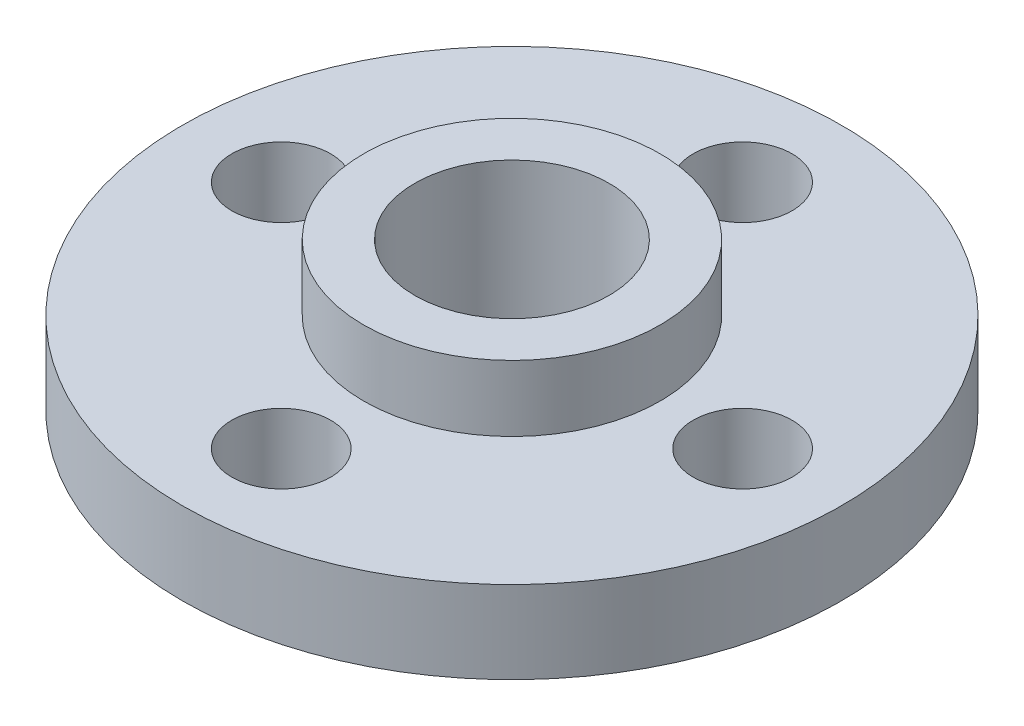
ISO-10303-21;
HEADER;
FILE_DESCRIPTION(('STEP AP214'),'2;1');
FILE_NAME('part.step','',(''),(''),'','','');
FILE_SCHEMA(('AUTOMOTIVE_DESIGN { 1 0 10303 214 1 1 1 1 }'));
ENDSEC;
DATA;
#1=APPLICATION_CONTEXT('core data for automotive mechanical design processes');
#2=APPLICATION_PROTOCOL_DEFINITION('international standard','automotive_design',2000,#1);
#3=PRODUCT_CONTEXT('',#1,'mechanical');
#4=PRODUCT('Part','Part','',(#3));
#5=PRODUCT_RELATED_PRODUCT_CATEGORY('part','',(#4));
#6=PRODUCT_DEFINITION_FORMATION('','',#4);
#7=PRODUCT_DEFINITION_CONTEXT('part definition',#1,'design');
#8=PRODUCT_DEFINITION('design','',#6,#7);
#9=PRODUCT_DEFINITION_SHAPE('','',#8);
#10=(LENGTH_UNIT() NAMED_UNIT(*) SI_UNIT(.MILLI.,.METRE.));
#11=(NAMED_UNIT(*) PLANE_ANGLE_UNIT() SI_UNIT($,.RADIAN.));
#12=(NAMED_UNIT(*) SI_UNIT($,.STERADIAN.) SOLID_ANGLE_UNIT());
#13=UNCERTAINTY_MEASURE_WITH_UNIT(LENGTH_MEASURE(1.E-05),#10,'distance_accuracy_value','');
#14=(GEOMETRIC_REPRESENTATION_CONTEXT(3) GLOBAL_UNCERTAINTY_ASSIGNED_CONTEXT((#13)) GLOBAL_UNIT_ASSIGNED_CONTEXT((#10,
#11,#12)) REPRESENTATION_CONTEXT('',''));
#15=CARTESIAN_POINT('',(0.,0.,0.));
#16=DIRECTION('',(0.,0.,1.));
#17=DIRECTION('',(1.,0.,0.));
#18=AXIS2_PLACEMENT_3D('',#15,#16,#17);
#19=CARTESIAN_POINT('',(0.,2.5,0.));
#20=DIRECTION('',(0.,1.,0.));
#21=DIRECTION('',(0.,0.,1.));
#22=AXIS2_PLACEMENT_3D('',#19,#20,#21);
#23=PLANE('',#22);
#24=CARTESIAN_POINT('',(0.,2.5,7.));
#25=DIRECTION('',(0.,1.,0.));
#26=DIRECTION('',(0.,0.,1.));
#27=AXIS2_PLACEMENT_3D('',#24,#25,#26);
#28=CIRCLE('',#27,1.5);
#29=CARTESIAN_POINT('',(0.,2.5,8.5));
#30=VERTEX_POINT('',#29);
#31=EDGE_CURVE('E55',#30,#30,#28,.T.);
#32=ORIENTED_EDGE('',*,*,#31,.F.);
#33=EDGE_LOOP('',(#32));
#34=FACE_BOUND('',#33,.T.);
#35=CARTESIAN_POINT('',(-7.,2.5,0.));
#36=DIRECTION('',(0.,1.,0.));
#37=DIRECTION('',(0.,0.,1.));
#38=AXIS2_PLACEMENT_3D('',#35,#36,#37);
#39=CIRCLE('',#38,1.5);
#40=CARTESIAN_POINT('',(-7.,2.5,1.5));
#41=VERTEX_POINT('',#40);
#42=EDGE_CURVE('E44',#41,#41,#39,.T.);
#43=ORIENTED_EDGE('',*,*,#42,.F.);
#44=EDGE_LOOP('',(#43));
#45=FACE_BOUND('',#44,.T.);
#46=CARTESIAN_POINT('',(0.,2.5,0.));
#47=DIRECTION('',(0.,1.,0.));
#48=DIRECTION('',(0.,0.,1.));
#49=AXIS2_PLACEMENT_3D('',#46,#47,#48);
#50=CIRCLE('',#49,10.);
#51=CARTESIAN_POINT('',(0.,2.5,10.));
#52=VERTEX_POINT('',#51);
#53=EDGE_CURVE('E10',#52,#52,#50,.T.);
#54=ORIENTED_EDGE('',*,*,#53,.T.);
#55=EDGE_LOOP('',(#54));
#56=FACE_BOUND('',#55,.T.);
#57=CARTESIAN_POINT('',(0.,2.5,-7.));
#58=DIRECTION('',(0.,1.,0.));
#59=DIRECTION('',(0.,0.,1.));
#60=AXIS2_PLACEMENT_3D('',#57,#58,#59);
#61=CIRCLE('',#60,1.5);
#62=CARTESIAN_POINT('',(0.,2.5,-5.5));
#63=VERTEX_POINT('',#62);
#64=EDGE_CURVE('E49',#63,#63,#61,.T.);
#65=ORIENTED_EDGE('',*,*,#64,.F.);
#66=EDGE_LOOP('',(#65));
#67=FACE_BOUND('',#66,.T.);
#68=CARTESIAN_POINT('',(7.,2.5,0.));
#69=DIRECTION('',(0.,1.,0.));
#70=DIRECTION('',(0.,0.,1.));
#71=AXIS2_PLACEMENT_3D('',#68,#69,#70);
#72=CIRCLE('',#71,1.5);
#73=CARTESIAN_POINT('',(7.,2.5,1.5));
#74=VERTEX_POINT('',#73);
#75=EDGE_CURVE('E61',#74,#74,#72,.T.);
#76=ORIENTED_EDGE('',*,*,#75,.F.);
#77=EDGE_LOOP('',(#76));
#78=FACE_BOUND('',#77,.T.);
#79=CARTESIAN_POINT('',(0.,2.5,0.));
#80=DIRECTION('',(0.,1.,0.));
#81=DIRECTION('',(0.,0.,1.));
#82=AXIS2_PLACEMENT_3D('',#79,#80,#81);
#83=CIRCLE('',#82,4.5);
#84=CARTESIAN_POINT('',(0.,2.5,4.5));
#85=VERTEX_POINT('',#84);
#86=EDGE_CURVE('E73',#85,#85,#83,.T.);
#87=ORIENTED_EDGE('',*,*,#86,.F.);
#88=EDGE_LOOP('',(#87));
#89=FACE_BOUND('',#88,.T.);
#90=ADVANCED_FACE('F33',(#34,#45,#56,#67,#78,#89),#23,.T.);
#91=CARTESIAN_POINT('',(0.,0.,0.));
#92=DIRECTION('',(0.,1.,0.));
#93=DIRECTION('',(0.,0.,1.));
#94=AXIS2_PLACEMENT_3D('',#91,#92,#93);
#95=PLANE('',#94);
#96=CARTESIAN_POINT('',(0.,0.,0.));
#97=DIRECTION('',(0.,1.,0.));
#98=DIRECTION('',(0.,0.,1.));
#99=AXIS2_PLACEMENT_3D('',#96,#97,#98);
#100=CIRCLE('',#99,10.);
#101=CARTESIAN_POINT('',(0.,0.,10.));
#102=VERTEX_POINT('',#101);
#103=EDGE_CURVE('E37',#102,#102,#100,.T.);
#104=ORIENTED_EDGE('',*,*,#103,.F.);
#105=EDGE_LOOP('',(#104));
#106=FACE_BOUND('',#105,.T.);
#107=CARTESIAN_POINT('',(-7.,0.,0.));
#108=DIRECTION('',(0.,1.,0.));
#109=DIRECTION('',(0.,0.,1.));
#110=AXIS2_PLACEMENT_3D('',#107,#108,#109);
#111=CIRCLE('',#110,1.5);
#112=CARTESIAN_POINT('',(-7.,0.,1.5));
#113=VERTEX_POINT('',#112);
#114=EDGE_CURVE('E46',#113,#113,#111,.T.);
#115=ORIENTED_EDGE('',*,*,#114,.T.);
#116=EDGE_LOOP('',(#115));
#117=FACE_BOUND('',#116,.T.);
#118=CARTESIAN_POINT('',(0.,0.,-7.));
#119=DIRECTION('',(0.,1.,0.));
#120=DIRECTION('',(0.,0.,1.));
#121=AXIS2_PLACEMENT_3D('',#118,#119,#120);
#122=CIRCLE('',#121,1.5);
#123=CARTESIAN_POINT('',(0.,0.,-5.5));
#124=VERTEX_POINT('',#123);
#125=EDGE_CURVE('E52',#124,#124,#122,.T.);
#126=ORIENTED_EDGE('',*,*,#125,.T.);
#127=EDGE_LOOP('',(#126));
#128=FACE_BOUND('',#127,.T.);
#129=CARTESIAN_POINT('',(0.,0.,7.));
#130=DIRECTION('',(0.,1.,0.));
#131=DIRECTION('',(0.,0.,1.));
#132=AXIS2_PLACEMENT_3D('',#129,#130,#131);
#133=CIRCLE('',#132,1.5);
#134=CARTESIAN_POINT('',(0.,0.,8.5));
#135=VERTEX_POINT('',#134);
#136=EDGE_CURVE('E58',#135,#135,#133,.T.);
#137=ORIENTED_EDGE('',*,*,#136,.T.);
#138=EDGE_LOOP('',(#137));
#139=FACE_BOUND('',#138,.T.);
#140=CARTESIAN_POINT('',(7.,0.,0.));
#141=DIRECTION('',(0.,1.,0.));
#142=DIRECTION('',(0.,0.,1.));
#143=AXIS2_PLACEMENT_3D('',#140,#141,#142);
#144=CIRCLE('',#143,1.5);
#145=CARTESIAN_POINT('',(7.,0.,1.5));
#146=VERTEX_POINT('',#145);
#147=EDGE_CURVE('E64',#146,#146,#144,.T.);
#148=ORIENTED_EDGE('',*,*,#147,.T.);
#149=EDGE_LOOP('',(#148));
#150=FACE_BOUND('',#149,.T.);
#151=CARTESIAN_POINT('',(0.,0.,0.));
#152=DIRECTION('',(0.,1.,0.));
#153=DIRECTION('',(0.,0.,1.));
#154=AXIS2_PLACEMENT_3D('',#151,#152,#153);
#155=CIRCLE('',#154,2.95);
#156=CARTESIAN_POINT('',(0.,0.,2.95));
#157=VERTEX_POINT('',#156);
#158=EDGE_CURVE('E67',#157,#157,#155,.T.);
#159=ORIENTED_EDGE('',*,*,#158,.T.);
#160=EDGE_LOOP('',(#159));
#161=FACE_BOUND('',#160,.T.);
#162=ADVANCED_FACE('F99',(#106,#117,#128,#139,#150,#161),#95,.F.);
#163=CARTESIAN_POINT('',(0.,2.5,0.));
#164=DIRECTION('',(0.,-1.,0.));
#165=DIRECTION('',(0.,0.,-1.));
#166=AXIS2_PLACEMENT_3D('',#163,#164,#165);
#167=CYLINDRICAL_SURFACE('',#166,10.);
#168=ORIENTED_EDGE('',*,*,#53,.F.);
#169=EDGE_LOOP('',(#168));
#170=FACE_BOUND('',#169,.T.);
#171=ORIENTED_EDGE('',*,*,#103,.T.);
#172=EDGE_LOOP('',(#171));
#173=FACE_BOUND('',#172,.T.);
#174=ADVANCED_FACE('F35',(#170,#173),#167,.T.);
#175=CARTESIAN_POINT('',(-7.,2.5,0.));
#176=DIRECTION('',(0.,-1.,0.));
#177=DIRECTION('',(0.,0.,-1.));
#178=AXIS2_PLACEMENT_3D('',#175,#176,#177);
#179=CYLINDRICAL_SURFACE('',#178,1.5);
#180=ORIENTED_EDGE('',*,*,#42,.T.);
#181=EDGE_LOOP('',(#180));
#182=FACE_BOUND('',#181,.T.);
#183=ORIENTED_EDGE('',*,*,#114,.F.);
#184=EDGE_LOOP('',(#183));
#185=FACE_BOUND('',#184,.T.);
#186=ADVANCED_FACE('F109',(#182,#185),#179,.F.);
#187=CARTESIAN_POINT('',(0.,2.5,-7.));
#188=DIRECTION('',(0.,-1.,0.));
#189=DIRECTION('',(0.,0.,-1.));
#190=AXIS2_PLACEMENT_3D('',#187,#188,#189);
#191=CYLINDRICAL_SURFACE('',#190,1.5);
#192=ORIENTED_EDGE('',*,*,#64,.T.);
#193=EDGE_LOOP('',(#192));
#194=FACE_BOUND('',#193,.T.);
#195=ORIENTED_EDGE('',*,*,#125,.F.);
#196=EDGE_LOOP('',(#195));
#197=FACE_BOUND('',#196,.T.);
#198=ADVANCED_FACE('F112',(#194,#197),#191,.F.);
#199=CARTESIAN_POINT('',(0.,2.5,7.));
#200=DIRECTION('',(0.,-1.,0.));
#201=DIRECTION('',(0.,0.,-1.));
#202=AXIS2_PLACEMENT_3D('',#199,#200,#201);
#203=CYLINDRICAL_SURFACE('',#202,1.5);
#204=ORIENTED_EDGE('',*,*,#31,.T.);
#205=EDGE_LOOP('',(#204));
#206=FACE_BOUND('',#205,.T.);
#207=ORIENTED_EDGE('',*,*,#136,.F.);
#208=EDGE_LOOP('',(#207));
#209=FACE_BOUND('',#208,.T.);
#210=ADVANCED_FACE('F116',(#206,#209),#203,.F.);
#211=CARTESIAN_POINT('',(7.,2.5,0.));
#212=DIRECTION('',(0.,-1.,0.));
#213=DIRECTION('',(0.,0.,-1.));
#214=AXIS2_PLACEMENT_3D('',#211,#212,#213);
#215=CYLINDRICAL_SURFACE('',#214,1.5);
#216=ORIENTED_EDGE('',*,*,#75,.T.);
#217=EDGE_LOOP('',(#216));
#218=FACE_BOUND('',#217,.T.);
#219=ORIENTED_EDGE('',*,*,#147,.F.);
#220=EDGE_LOOP('',(#219));
#221=FACE_BOUND('',#220,.T.);
#222=ADVANCED_FACE('F95',(#218,#221),#215,.F.);
#223=CARTESIAN_POINT('',(0.,2.5,0.));
#224=DIRECTION('',(0.,-1.,0.));
#225=DIRECTION('',(0.,0.,-1.));
#226=AXIS2_PLACEMENT_3D('',#223,#224,#225);
#227=CYLINDRICAL_SURFACE('',#226,2.95);
#228=ORIENTED_EDGE('',*,*,#158,.F.);
#229=EDGE_LOOP('',(#228));
#230=FACE_BOUND('',#229,.T.);
#231=CARTESIAN_POINT('',(0.,4.5,0.));
#232=DIRECTION('',(0.,1.,0.));
#233=DIRECTION('',(0.,0.,1.));
#234=AXIS2_PLACEMENT_3D('',#231,#232,#233);
#235=CIRCLE('',#234,2.95);
#236=CARTESIAN_POINT('',(0.,4.5,2.95));
#237=VERTEX_POINT('',#236);
#238=EDGE_CURVE('E76',#237,#237,#235,.T.);
#239=ORIENTED_EDGE('',*,*,#238,.T.);
#240=EDGE_LOOP('',(#239));
#241=FACE_BOUND('',#240,.T.);
#242=ADVANCED_FACE('F82',(#230,#241),#227,.F.);
#243=CARTESIAN_POINT('',(0.,4.5,0.));
#244=DIRECTION('',(0.,1.,0.));
#245=DIRECTION('',(0.,0.,1.));
#246=AXIS2_PLACEMENT_3D('',#243,#244,#245);
#247=PLANE('',#246);
#248=CARTESIAN_POINT('',(0.,4.5,0.));
#249=DIRECTION('',(0.,1.,0.));
#250=DIRECTION('',(0.,0.,1.));
#251=AXIS2_PLACEMENT_3D('',#248,#249,#250);
#252=CIRCLE('',#251,4.5);
#253=CARTESIAN_POINT('',(0.,4.5,4.5));
#254=VERTEX_POINT('',#253);
#255=EDGE_CURVE('E72',#254,#254,#252,.T.);
#256=ORIENTED_EDGE('',*,*,#255,.T.);
#257=EDGE_LOOP('',(#256));
#258=FACE_BOUND('',#257,.T.);
#259=ORIENTED_EDGE('',*,*,#238,.F.);
#260=EDGE_LOOP('',(#259));
#261=FACE_BOUND('',#260,.T.);
#262=ADVANCED_FACE('F84',(#258,#261),#247,.T.);
#263=CARTESIAN_POINT('',(0.,4.5,0.));
#264=DIRECTION('',(0.,-1.,0.));
#265=DIRECTION('',(0.,0.,-1.));
#266=AXIS2_PLACEMENT_3D('',#263,#264,#265);
#267=CYLINDRICAL_SURFACE('',#266,4.5);
#268=ORIENTED_EDGE('',*,*,#255,.F.);
#269=EDGE_LOOP('',(#268));
#270=FACE_BOUND('',#269,.T.);
#271=ORIENTED_EDGE('',*,*,#86,.T.);
#272=EDGE_LOOP('',(#271));
#273=FACE_BOUND('',#272,.T.);
#274=ADVANCED_FACE('F86',(#270,#273),#267,.T.);
#275=CLOSED_SHELL('',(#90,#162,#174,#186,#198,#210,#222,#242,#262,#274));
#276=MANIFOLD_SOLID_BREP('B2',#275);
#277=ADVANCED_BREP_SHAPE_REPRESENTATION('',(#18,#276),#14);
#278=SHAPE_DEFINITION_REPRESENTATION(#9,#277);
ENDSEC;
END-ISO-10303-21;
